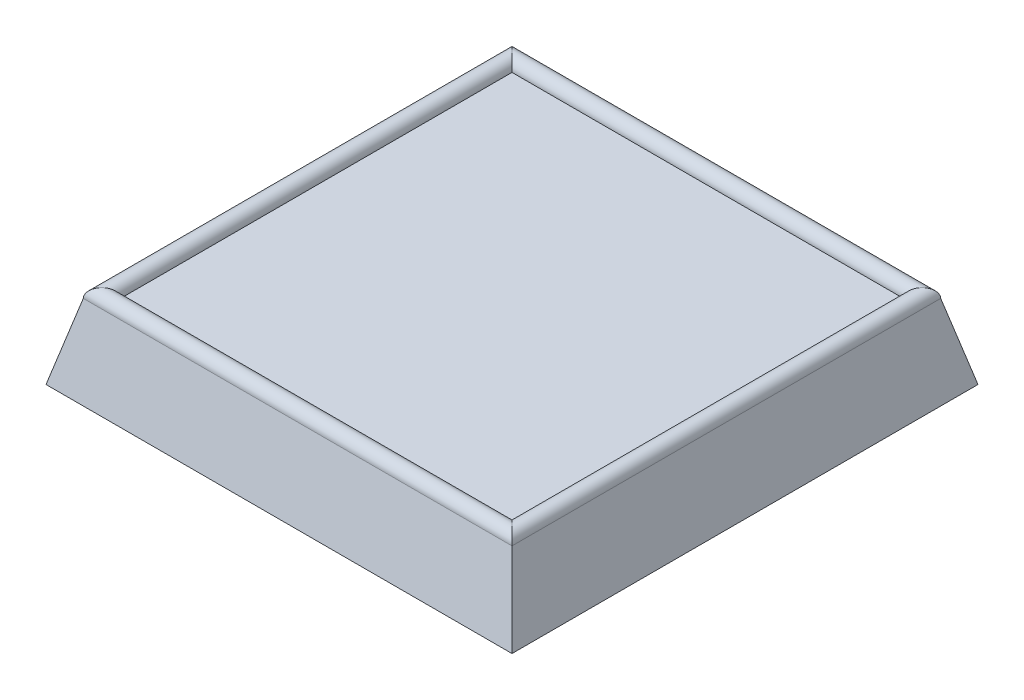
ISO-10303-21;
HEADER;
FILE_DESCRIPTION(('STEP AP214'),'2;1');
FILE_NAME('part.step','',(''),(''),'','','');
FILE_SCHEMA(('AUTOMOTIVE_DESIGN { 1 0 10303 214 1 1 1 1 }'));
ENDSEC;
DATA;
#1=APPLICATION_CONTEXT('core data for automotive mechanical design processes');
#2=APPLICATION_PROTOCOL_DEFINITION('international standard','automotive_design',2000,#1);
#3=PRODUCT_CONTEXT('',#1,'mechanical');
#4=PRODUCT('Part','Part','',(#3));
#5=PRODUCT_RELATED_PRODUCT_CATEGORY('part','',(#4));
#6=PRODUCT_DEFINITION_FORMATION('','',#4);
#7=PRODUCT_DEFINITION_CONTEXT('part definition',#1,'design');
#8=PRODUCT_DEFINITION('design','',#6,#7);
#9=PRODUCT_DEFINITION_SHAPE('','',#8);
#10=(LENGTH_UNIT() NAMED_UNIT(*) SI_UNIT(.MILLI.,.METRE.));
#11=(NAMED_UNIT(*) PLANE_ANGLE_UNIT() SI_UNIT($,.RADIAN.));
#12=(NAMED_UNIT(*) SI_UNIT($,.STERADIAN.) SOLID_ANGLE_UNIT());
#13=UNCERTAINTY_MEASURE_WITH_UNIT(LENGTH_MEASURE(1.E-05),#10,'distance_accuracy_value','');
#14=(GEOMETRIC_REPRESENTATION_CONTEXT(3) GLOBAL_UNCERTAINTY_ASSIGNED_CONTEXT((#13)) GLOBAL_UNIT_ASSIGNED_CONTEXT((#10,
#11,#12)) REPRESENTATION_CONTEXT('',''));
#15=CARTESIAN_POINT('',(0.,0.,0.));
#16=DIRECTION('',(0.,0.,1.));
#17=DIRECTION('',(1.,0.,0.));
#18=AXIS2_PLACEMENT_3D('',#15,#16,#17);
#19=CARTESIAN_POINT('',(0.,-40.,0.));
#20=DIRECTION('',(0.,1.,0.));
#21=DIRECTION('',(0.,0.,1.));
#22=AXIS2_PLACEMENT_3D('',#19,#20,#21);
#23=PLANE('',#22);
#24=DIRECTION('',(1.,0.,0.));
#25=VECTOR('',#24,1.);
#26=CARTESIAN_POINT('',(-125.,-40.,125.));
#27=LINE('',#26,#25);
#28=CARTESIAN_POINT('',(-125.,-40.,125.));
#29=VERTEX_POINT('',#28);
#30=CARTESIAN_POINT('',(125.,-40.,125.));
#31=VERTEX_POINT('',#30);
#32=EDGE_CURVE('E210',#29,#31,#27,.T.);
#33=ORIENTED_EDGE('',*,*,#32,.F.);
#34=DIRECTION('',(0.,0.,1.));
#35=VECTOR('',#34,1.);
#36=CARTESIAN_POINT('',(-125.,-40.,125.));
#37=LINE('',#36,#35);
#38=CARTESIAN_POINT('',(-125.,-40.,-125.));
#39=VERTEX_POINT('',#38);
#40=EDGE_CURVE('E12',#39,#29,#37,.T.);
#41=ORIENTED_EDGE('',*,*,#40,.F.);
#42=DIRECTION('',(-1.,0.,0.));
#43=VECTOR('',#42,1.);
#44=CARTESIAN_POINT('',(-125.,-40.,-125.));
#45=LINE('',#44,#43);
#46=CARTESIAN_POINT('',(125.,-40.,-125.));
#47=VERTEX_POINT('',#46);
#48=EDGE_CURVE('E67',#47,#39,#45,.T.);
#49=ORIENTED_EDGE('',*,*,#48,.F.);
#50=DIRECTION('',(0.,0.,-1.));
#51=VECTOR('',#50,1.);
#52=CARTESIAN_POINT('',(125.,-40.,125.));
#53=LINE('',#52,#51);
#54=EDGE_CURVE('E196',#31,#47,#53,.T.);
#55=ORIENTED_EDGE('',*,*,#54,.F.);
#56=EDGE_LOOP('',(#33,#41,#49,#55));
#57=FACE_BOUND('',#56,.T.);
#58=ADVANCED_FACE('F57',(#57),#23,.F.);
#59=CARTESIAN_POINT('',(0.,27.0588235294118,-108.235294117647));
#60=DIRECTION('',(0.,0.242535625036333,-0.970142500145332));
#61=DIRECTION('',(0.,0.970142500145332,0.242535625036333));
#62=AXIS2_PLACEMENT_3D('',#59,#60,#61);
#63=PLANE('',#62);
#64=DIRECTION('',(0.235702260395516,-0.942809041582063,-0.235702260395516));
#65=VECTOR('',#64,1.);
#66=CARTESIAN_POINT('',(115.,0.,-115.));
#67=LINE('',#66,#65);
#68=CARTESIAN_POINT('',(115.,0.,-115.));
#69=VERTEX_POINT('',#68);
#70=EDGE_CURVE('E250',#69,#47,#67,.T.);
#71=ORIENTED_EDGE('',*,*,#70,.T.);
#72=ORIENTED_EDGE('',*,*,#48,.T.);
#73=DIRECTION('',(-0.235702260395515,-0.942809041582063,-0.235702260395516));
#74=VECTOR('',#73,1.);
#75=CARTESIAN_POINT('',(-115.,0.,-115.));
#76=LINE('',#75,#74);
#77=CARTESIAN_POINT('',(-115.,0.,-115.));
#78=VERTEX_POINT('',#77);
#79=EDGE_CURVE('E151',#78,#39,#76,.T.);
#80=ORIENTED_EDGE('',*,*,#79,.F.);
#81=DIRECTION('',(-1.,0.,0.));
#82=VECTOR('',#81,1.);
#83=CARTESIAN_POINT('',(-115.,0.,-115.));
#84=LINE('',#83,#82);
#85=EDGE_CURVE('E61',#69,#78,#84,.T.);
#86=ORIENTED_EDGE('',*,*,#85,.F.);
#87=EDGE_LOOP('',(#71,#72,#80,#86));
#88=FACE_BOUND('',#87,.T.);
#89=ADVANCED_FACE('F164',(#88),#63,.T.);
#90=CARTESIAN_POINT('',(-108.235294117647,27.0588235294117,0.));
#91=DIRECTION('',(-0.970142500145332,0.242535625036333,0.));
#92=DIRECTION('',(-0.242535625036333,-0.970142500145332,0.));
#93=AXIS2_PLACEMENT_3D('',#90,#91,#92);
#94=PLANE('',#93);
#95=ORIENTED_EDGE('',*,*,#79,.T.);
#96=ORIENTED_EDGE('',*,*,#40,.T.);
#97=DIRECTION('',(-0.235702260395515,-0.942809041582063,0.235702260395516));
#98=VECTOR('',#97,1.);
#99=CARTESIAN_POINT('',(-115.,0.,115.));
#100=LINE('',#99,#98);
#101=CARTESIAN_POINT('',(-115.,0.,115.));
#102=VERTEX_POINT('',#101);
#103=EDGE_CURVE('E238',#102,#29,#100,.T.);
#104=ORIENTED_EDGE('',*,*,#103,.F.);
#105=DIRECTION('',(0.,0.,1.));
#106=VECTOR('',#105,1.);
#107=CARTESIAN_POINT('',(-115.,0.,115.));
#108=LINE('',#107,#106);
#109=EDGE_CURVE('E145',#78,#102,#108,.T.);
#110=ORIENTED_EDGE('',*,*,#109,.F.);
#111=EDGE_LOOP('',(#95,#96,#104,#110));
#112=FACE_BOUND('',#111,.T.);
#113=ADVANCED_FACE('F153',(#112),#94,.T.);
#114=CARTESIAN_POINT('',(108.235294117647,27.0588235294118,0.));
#115=DIRECTION('',(0.970142500145332,0.242535625036334,0.));
#116=DIRECTION('',(-0.242535625036334,0.970142500145332,0.));
#117=AXIS2_PLACEMENT_3D('',#114,#115,#116);
#118=PLANE('',#117);
#119=DIRECTION('',(0.235702260395516,-0.942809041582063,0.235702260395516));
#120=VECTOR('',#119,1.);
#121=CARTESIAN_POINT('',(115.,0.,115.));
#122=LINE('',#121,#120);
#123=CARTESIAN_POINT('',(115.,0.,115.));
#124=VERTEX_POINT('',#123);
#125=EDGE_CURVE('E236',#124,#31,#122,.T.);
#126=ORIENTED_EDGE('',*,*,#125,.T.);
#127=ORIENTED_EDGE('',*,*,#54,.T.);
#128=ORIENTED_EDGE('',*,*,#70,.F.);
#129=DIRECTION('',(0.,0.,-1.));
#130=VECTOR('',#129,1.);
#131=CARTESIAN_POINT('',(115.,0.,115.));
#132=LINE('',#131,#130);
#133=EDGE_CURVE('E133',#124,#69,#132,.T.);
#134=ORIENTED_EDGE('',*,*,#133,.F.);
#135=EDGE_LOOP('',(#126,#127,#128,#134));
#136=FACE_BOUND('',#135,.T.);
#137=ADVANCED_FACE('F163',(#136),#118,.T.);
#138=CARTESIAN_POINT('',(0.,27.0588235294117,108.235294117647));
#139=DIRECTION('',(0.,0.242535625036333,0.970142500145332));
#140=DIRECTION('',(0.,-0.970142500145332,0.242535625036333));
#141=AXIS2_PLACEMENT_3D('',#138,#139,#140);
#142=PLANE('',#141);
#143=ORIENTED_EDGE('',*,*,#103,.T.);
#144=ORIENTED_EDGE('',*,*,#32,.T.);
#145=ORIENTED_EDGE('',*,*,#125,.F.);
#146=DIRECTION('',(1.,0.,0.));
#147=VECTOR('',#146,1.);
#148=CARTESIAN_POINT('',(-115.,0.,115.));
#149=LINE('',#148,#147);
#150=EDGE_CURVE('E122',#102,#124,#149,.T.);
#151=ORIENTED_EDGE('',*,*,#150,.F.);
#152=EDGE_LOOP('',(#143,#144,#145,#151));
#153=FACE_BOUND('',#152,.T.);
#154=ADVANCED_FACE('F215',(#153),#142,.T.);
#155=CARTESIAN_POINT('',(-110.,0.,-115.));
#156=DIRECTION('',(0.,0.,1.));
#157=DIRECTION('',(1.,0.,0.));
#158=AXIS2_PLACEMENT_3D('',#155,#156,#157);
#159=CYLINDRICAL_SURFACE('',#158,4.99999999999999);
#160=ORIENTED_EDGE('',*,*,#109,.T.);
#161=CARTESIAN_POINT('',(-110.,0.,110.));
#162=DIRECTION('',(0.707106781186548,0.,0.707106781186548));
#163=DIRECTION('',(0.707106781186548,0.,-0.707106781186548));
#164=AXIS2_PLACEMENT_3D('',#161,#162,#163);
#165=ELLIPSE('',#164,7.07106781186546,4.99999999999999);
#166=CARTESIAN_POINT('',(-105.,0.,105.));
#167=VERTEX_POINT('',#166);
#168=EDGE_CURVE('E116',#102,#167,#165,.F.);
#169=ORIENTED_EDGE('',*,*,#168,.T.);
#170=DIRECTION('',(0.,0.,1.));
#171=VECTOR('',#170,1.);
#172=CARTESIAN_POINT('',(-105.,0.,-115.));
#173=LINE('',#172,#171);
#174=CARTESIAN_POINT('',(-105.,0.,-105.));
#175=VERTEX_POINT('',#174);
#176=EDGE_CURVE('E75',#175,#167,#173,.T.);
#177=ORIENTED_EDGE('',*,*,#176,.F.);
#178=CARTESIAN_POINT('',(-110.,0.,-110.));
#179=DIRECTION('',(-0.707106781186548,0.,0.707106781186547));
#180=DIRECTION('',(-0.707106781186547,0.,-0.707106781186548));
#181=AXIS2_PLACEMENT_3D('',#178,#179,#180);
#182=ELLIPSE('',#181,7.07106781186546,4.99999999999999);
#183=EDGE_CURVE('E127',#78,#175,#182,.F.);
#184=ORIENTED_EDGE('',*,*,#183,.F.);
#185=EDGE_LOOP('',(#160,#169,#177,#184));
#186=FACE_BOUND('',#185,.T.);
#187=ADVANCED_FACE('F223',(#186),#159,.T.);
#188=CARTESIAN_POINT('',(-115.,0.,110.));
#189=DIRECTION('',(1.,0.,0.));
#190=DIRECTION('',(0.,0.,-1.));
#191=AXIS2_PLACEMENT_3D('',#188,#189,#190);
#192=CYLINDRICAL_SURFACE('',#191,4.99999999999999);
#193=ORIENTED_EDGE('',*,*,#150,.T.);
#194=CARTESIAN_POINT('',(110.,0.,110.));
#195=DIRECTION('',(0.707106781186548,0.,-0.707106781186548));
#196=DIRECTION('',(-0.707106781186548,0.,-0.707106781186548));
#197=AXIS2_PLACEMENT_3D('',#194,#195,#196);
#198=ELLIPSE('',#197,7.07106781186546,4.99999999999999);
#199=CARTESIAN_POINT('',(105.,0.,105.));
#200=VERTEX_POINT('',#199);
#201=EDGE_CURVE('E120',#124,#200,#198,.F.);
#202=ORIENTED_EDGE('',*,*,#201,.T.);
#203=DIRECTION('',(1.,0.,0.));
#204=VECTOR('',#203,1.);
#205=CARTESIAN_POINT('',(-115.,0.,105.));
#206=LINE('',#205,#204);
#207=EDGE_CURVE('E109',#167,#200,#206,.T.);
#208=ORIENTED_EDGE('',*,*,#207,.F.);
#209=ORIENTED_EDGE('',*,*,#168,.F.);
#210=EDGE_LOOP('',(#193,#202,#208,#209));
#211=FACE_BOUND('',#210,.T.);
#212=ADVANCED_FACE('F121',(#211),#192,.T.);
#213=CARTESIAN_POINT('',(115.,0.,-110.));
#214=DIRECTION('',(-1.,0.,0.));
#215=DIRECTION('',(0.,0.,1.));
#216=AXIS2_PLACEMENT_3D('',#213,#214,#215);
#217=CYLINDRICAL_SURFACE('',#216,4.99999999999999);
#218=ORIENTED_EDGE('',*,*,#85,.T.);
#219=ORIENTED_EDGE('',*,*,#183,.T.);
#220=DIRECTION('',(-1.,0.,0.));
#221=VECTOR('',#220,1.);
#222=CARTESIAN_POINT('',(115.,0.,-105.));
#223=LINE('',#222,#221);
#224=CARTESIAN_POINT('',(105.,0.,-105.));
#225=VERTEX_POINT('',#224);
#226=EDGE_CURVE('E80',#225,#175,#223,.T.);
#227=ORIENTED_EDGE('',*,*,#226,.F.);
#228=CARTESIAN_POINT('',(110.,0.,-110.));
#229=DIRECTION('',(-0.707106781186548,0.,-0.707106781186548));
#230=DIRECTION('',(0.707106781186548,0.,-0.707106781186547));
#231=AXIS2_PLACEMENT_3D('',#228,#229,#230);
#232=ELLIPSE('',#231,7.07106781186546,4.99999999999999);
#233=EDGE_CURVE('E126',#69,#225,#232,.F.);
#234=ORIENTED_EDGE('',*,*,#233,.F.);
#235=EDGE_LOOP('',(#218,#219,#227,#234));
#236=FACE_BOUND('',#235,.T.);
#237=ADVANCED_FACE('F324',(#236),#217,.T.);
#238=CARTESIAN_POINT('',(110.,0.,115.));
#239=DIRECTION('',(0.,0.,-1.));
#240=DIRECTION('',(-1.,0.,0.));
#241=AXIS2_PLACEMENT_3D('',#238,#239,#240);
#242=CYLINDRICAL_SURFACE('',#241,4.99999999999999);
#243=ORIENTED_EDGE('',*,*,#201,.F.);
#244=ORIENTED_EDGE('',*,*,#133,.T.);
#245=ORIENTED_EDGE('',*,*,#233,.T.);
#246=DIRECTION('',(0.,0.,-1.));
#247=VECTOR('',#246,1.);
#248=CARTESIAN_POINT('',(105.,0.,115.));
#249=LINE('',#248,#247);
#250=EDGE_CURVE('E113',#200,#225,#249,.T.);
#251=ORIENTED_EDGE('',*,*,#250,.F.);
#252=EDGE_LOOP('',(#243,#244,#245,#251));
#253=FACE_BOUND('',#252,.T.);
#254=ADVANCED_FACE('F130',(#253),#242,.T.);
#255=CARTESIAN_POINT('',(0.,0.,0.));
#256=DIRECTION('',(0.,1.,0.));
#257=DIRECTION('',(0.,0.,1.));
#258=AXIS2_PLACEMENT_3D('',#255,#256,#257);
#259=PLANE('',#258);
#260=ORIENTED_EDGE('',*,*,#176,.T.);
#261=ORIENTED_EDGE('',*,*,#207,.T.);
#262=ORIENTED_EDGE('',*,*,#250,.T.);
#263=ORIENTED_EDGE('',*,*,#226,.T.);
#264=EDGE_LOOP('',(#260,#261,#262,#263));
#265=FACE_BOUND('',#264,.T.);
#266=ADVANCED_FACE('F111',(#265),#259,.T.);
#267=CLOSED_SHELL('',(#58,#89,#113,#137,#154,#187,#212,#237,#254,#266));
#268=MANIFOLD_SOLID_BREP('B2',#267);
#269=ADVANCED_BREP_SHAPE_REPRESENTATION('',(#18,#268),#14);
#270=SHAPE_DEFINITION_REPRESENTATION(#9,#269);
ENDSEC;
END-ISO-10303-21;
